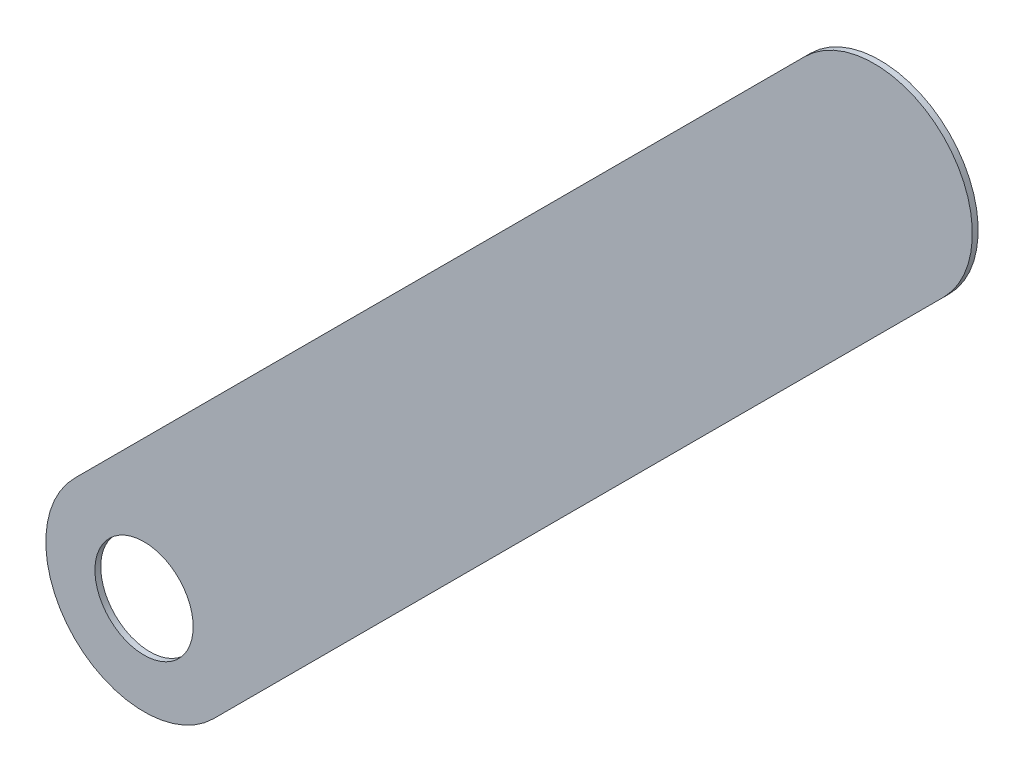
ISO-10303-21;
HEADER;
FILE_DESCRIPTION(('STEP AP214'),'2;1');
FILE_NAME('part.step','',(''),(''),'','','');
FILE_SCHEMA(('AUTOMOTIVE_DESIGN { 1 0 10303 214 1 1 1 1 }'));
ENDSEC;
DATA;
#1=APPLICATION_CONTEXT('core data for automotive mechanical design processes');
#2=APPLICATION_PROTOCOL_DEFINITION('international standard','automotive_design',2000,#1);
#3=PRODUCT_CONTEXT('',#1,'mechanical');
#4=PRODUCT('Part','Part','',(#3));
#5=PRODUCT_RELATED_PRODUCT_CATEGORY('part','',(#4));
#6=PRODUCT_DEFINITION_FORMATION('','',#4);
#7=PRODUCT_DEFINITION_CONTEXT('part definition',#1,'design');
#8=PRODUCT_DEFINITION('design','',#6,#7);
#9=PRODUCT_DEFINITION_SHAPE('','',#8);
#10=(LENGTH_UNIT() NAMED_UNIT(*) SI_UNIT(.MILLI.,.METRE.));
#11=(NAMED_UNIT(*) PLANE_ANGLE_UNIT() SI_UNIT($,.RADIAN.));
#12=(NAMED_UNIT(*) SI_UNIT($,.STERADIAN.) SOLID_ANGLE_UNIT());
#13=UNCERTAINTY_MEASURE_WITH_UNIT(LENGTH_MEASURE(1.E-05),#10,'distance_accuracy_value','');
#14=(GEOMETRIC_REPRESENTATION_CONTEXT(3) GLOBAL_UNCERTAINTY_ASSIGNED_CONTEXT((#13)) GLOBAL_UNIT_ASSIGNED_CONTEXT((#10,
#11,#12)) REPRESENTATION_CONTEXT('',''));
#15=CARTESIAN_POINT('',(0.,0.,0.));
#16=DIRECTION('',(0.,0.,1.));
#17=DIRECTION('',(1.,0.,0.));
#18=AXIS2_PLACEMENT_3D('',#15,#16,#17);
#19=CARTESIAN_POINT('',(55.32428102,78.07575698,0.));
#20=DIRECTION('',(-0.707106781186548,0.707106781186548,0.));
#21=DIRECTION('',(0.707106781186548,0.707106781186548,0.));
#22=AXIS2_PLACEMENT_3D('',#19,#20,#21);
#23=PLANE('',#22);
#24=DIRECTION('',(0.707106781186548,0.707106781186548,0.));
#25=VECTOR('',#24,1.);
#26=CARTESIAN_POINT('',(55.32428102,78.07575698,0.03556));
#27=LINE('',#26,#25);
#28=CARTESIAN_POINT('',(55.32428102,78.07575698,0.03556));
#29=VERTEX_POINT('',#28);
#30=CARTESIAN_POINT('',(59.78426702,82.53574298,0.03556));
#31=VERTEX_POINT('',#30);
#32=EDGE_CURVE('E11',#29,#31,#27,.T.);
#33=ORIENTED_EDGE('',*,*,#32,.F.);
#34=DIRECTION('',(0.,0.,1.));
#35=VECTOR('',#34,1.);
#36=CARTESIAN_POINT('',(55.32428102,78.07575698,0.));
#37=LINE('',#36,#35);
#38=CARTESIAN_POINT('',(55.32428102,78.07575698,0.));
#39=VERTEX_POINT('',#38);
#40=EDGE_CURVE('E24',#39,#29,#37,.T.);
#41=ORIENTED_EDGE('',*,*,#40,.F.);
#42=DIRECTION('',(0.707106781186548,0.707106781186548,0.));
#43=VECTOR('',#42,1.);
#44=CARTESIAN_POINT('',(55.32428102,78.07575698,0.));
#45=LINE('',#44,#43);
#46=CARTESIAN_POINT('',(59.78426702,82.53574298,0.));
#47=VERTEX_POINT('',#46);
#48=EDGE_CURVE('E96',#39,#47,#45,.T.);
#49=ORIENTED_EDGE('',*,*,#48,.T.);
#50=DIRECTION('',(0.,0.,1.));
#51=VECTOR('',#50,1.);
#52=CARTESIAN_POINT('',(59.78426702,82.53574298,0.));
#53=LINE('',#52,#51);
#54=EDGE_CURVE('E37',#47,#31,#53,.T.);
#55=ORIENTED_EDGE('',*,*,#54,.T.);
#56=EDGE_LOOP('',(#33,#41,#49,#55));
#57=FACE_BOUND('',#56,.T.);
#58=ADVANCED_FACE('F17',(#57),#23,.F.);
#59=CARTESIAN_POINT('',(54.9000172,78.5000208,0.));
#60=DIRECTION('',(0.,0.,-1.));
#61=DIRECTION('',(-0.707106781186536,0.707106781186559,0.));
#62=AXIS2_PLACEMENT_3D('',#59,#60,#61);
#63=CYLINDRICAL_SURFACE('',#62,0.599999648268213);
#64=CARTESIAN_POINT('',(54.9000172,78.5000208,0.03556));
#65=DIRECTION('',(0.,0.,1.));
#66=DIRECTION('',(-0.707106781186536,0.707106781186559,0.));
#67=AXIS2_PLACEMENT_3D('',#64,#65,#66);
#68=CIRCLE('',#67,0.599999648268213);
#69=CARTESIAN_POINT('',(54.47575338,78.92428462,0.03556));
#70=VERTEX_POINT('',#69);
#71=EDGE_CURVE('E92',#70,#29,#68,.T.);
#72=ORIENTED_EDGE('',*,*,#71,.F.);
#73=DIRECTION('',(0.,0.,1.));
#74=VECTOR('',#73,1.);
#75=CARTESIAN_POINT('',(54.47575338,78.92428462,0.));
#76=LINE('',#75,#74);
#77=CARTESIAN_POINT('',(54.47575338,78.92428462,0.));
#78=VERTEX_POINT('',#77);
#79=EDGE_CURVE('E90',#78,#70,#76,.T.);
#80=ORIENTED_EDGE('',*,*,#79,.F.);
#81=CARTESIAN_POINT('',(54.9000172,78.5000208,0.));
#82=DIRECTION('',(0.,0.,1.));
#83=DIRECTION('',(-0.707106781186536,0.707106781186559,0.));
#84=AXIS2_PLACEMENT_3D('',#81,#82,#83);
#85=CIRCLE('',#84,0.599999648268213);
#86=EDGE_CURVE('E88',#78,#39,#85,.T.);
#87=ORIENTED_EDGE('',*,*,#86,.T.);
#88=ORIENTED_EDGE('',*,*,#40,.T.);
#89=EDGE_LOOP('',(#72,#80,#87,#88));
#90=FACE_BOUND('',#89,.T.);
#91=ADVANCED_FACE('F111',(#90),#63,.T.);
#92=CARTESIAN_POINT('',(59.3600032,82.9600068,0.));
#93=DIRECTION('',(0.,0.,-1.));
#94=DIRECTION('',(0.707106781186542,-0.707106781186554,0.));
#95=AXIS2_PLACEMENT_3D('',#92,#93,#94);
#96=CYLINDRICAL_SURFACE('',#95,0.599999648268216);
#97=CARTESIAN_POINT('',(59.3600032,82.9600068,0.03556));
#98=DIRECTION('',(0.,0.,1.));
#99=DIRECTION('',(0.707106781186542,-0.707106781186554,0.));
#100=AXIS2_PLACEMENT_3D('',#97,#98,#99);
#101=CIRCLE('',#100,0.599999648268216);
#102=CARTESIAN_POINT('',(58.93573938,83.38427062,0.03556));
#103=VERTEX_POINT('',#102);
#104=EDGE_CURVE('E85',#31,#103,#101,.T.);
#105=ORIENTED_EDGE('',*,*,#104,.F.);
#106=ORIENTED_EDGE('',*,*,#54,.F.);
#107=CARTESIAN_POINT('',(59.3600032,82.9600068,0.));
#108=DIRECTION('',(0.,0.,1.));
#109=DIRECTION('',(0.707106781186542,-0.707106781186554,0.));
#110=AXIS2_PLACEMENT_3D('',#107,#108,#109);
#111=CIRCLE('',#110,0.599999648268216);
#112=CARTESIAN_POINT('',(58.93573938,83.38427062,0.));
#113=VERTEX_POINT('',#112);
#114=EDGE_CURVE('E82',#47,#113,#111,.T.);
#115=ORIENTED_EDGE('',*,*,#114,.T.);
#116=DIRECTION('',(0.,0.,1.));
#117=VECTOR('',#116,1.);
#118=CARTESIAN_POINT('',(58.93573938,83.38427062,0.));
#119=LINE('',#118,#117);
#120=EDGE_CURVE('E80',#113,#103,#119,.T.);
#121=ORIENTED_EDGE('',*,*,#120,.T.);
#122=EDGE_LOOP('',(#105,#106,#115,#121));
#123=FACE_BOUND('',#122,.T.);
#124=ADVANCED_FACE('F104',(#123),#96,.T.);
#125=CARTESIAN_POINT('',(58.93573938,83.38427062,0.));
#126=DIRECTION('',(0.707106781186548,-0.707106781186547,0.));
#127=DIRECTION('',(-0.707106781186547,-0.707106781186548,0.));
#128=AXIS2_PLACEMENT_3D('',#125,#126,#127);
#129=PLANE('',#128);
#130=DIRECTION('',(-0.707106781186547,-0.707106781186548,0.));
#131=VECTOR('',#130,1.);
#132=CARTESIAN_POINT('',(58.93573938,83.38427062,0.03556));
#133=LINE('',#132,#131);
#134=EDGE_CURVE('E77',#103,#70,#133,.T.);
#135=ORIENTED_EDGE('',*,*,#134,.F.);
#136=ORIENTED_EDGE('',*,*,#120,.F.);
#137=DIRECTION('',(-0.707106781186547,-0.707106781186548,0.));
#138=VECTOR('',#137,1.);
#139=CARTESIAN_POINT('',(58.93573938,83.38427062,0.));
#140=LINE('',#139,#138);
#141=EDGE_CURVE('E68',#113,#78,#140,.T.);
#142=ORIENTED_EDGE('',*,*,#141,.T.);
#143=ORIENTED_EDGE('',*,*,#79,.T.);
#144=EDGE_LOOP('',(#135,#136,#142,#143));
#145=FACE_BOUND('',#144,.T.);
#146=ADVANCED_FACE('F110',(#145),#129,.F.);
#147=CARTESIAN_POINT('',(54.9000172,78.5000208,0.));
#148=DIRECTION('',(0.,0.,-1.));
#149=DIRECTION('',(1.,0.,0.));
#150=AXIS2_PLACEMENT_3D('',#147,#148,#149);
#151=CYLINDRICAL_SURFACE('',#150,0.2999994);
#152=DIRECTION('',(0.,0.,1.));
#153=VECTOR('',#152,1.);
#154=CARTESIAN_POINT('',(55.2000166,78.5000208,0.));
#155=LINE('',#154,#153);
#156=CARTESIAN_POINT('',(55.2000166,78.5000208,0.));
#157=VERTEX_POINT('',#156);
#158=CARTESIAN_POINT('',(55.2000166,78.5000208,0.03556));
#159=VERTEX_POINT('',#158);
#160=EDGE_CURVE('E62',#157,#159,#155,.T.);
#161=ORIENTED_EDGE('',*,*,#160,.T.);
#162=CARTESIAN_POINT('',(54.9000172,78.5000208,0.03556));
#163=DIRECTION('',(0.,0.,1.));
#164=DIRECTION('',(1.,0.,0.));
#165=AXIS2_PLACEMENT_3D('',#162,#163,#164);
#166=CIRCLE('',#165,0.2999994);
#167=EDGE_CURVE('E67',#159,#159,#166,.T.);
#168=ORIENTED_EDGE('',*,*,#167,.T.);
#169=ORIENTED_EDGE('',*,*,#160,.F.);
#170=CARTESIAN_POINT('',(54.9000172,78.5000208,0.));
#171=DIRECTION('',(0.,0.,1.));
#172=DIRECTION('',(1.,0.,0.));
#173=AXIS2_PLACEMENT_3D('',#170,#171,#172);
#174=CIRCLE('',#173,0.2999994);
#175=EDGE_CURVE('E65',#157,#157,#174,.T.);
#176=ORIENTED_EDGE('',*,*,#175,.F.);
#177=EDGE_LOOP('',(#161,#168,#169,#176));
#178=FACE_BOUND('',#177,.T.);
#179=ADVANCED_FACE('F64',(#178),#151,.F.);
#180=CARTESIAN_POINT('',(55.32428102,78.07575698,0.));
#181=DIRECTION('',(0.,0.,-1.));
#182=DIRECTION('',(-1.,0.,0.));
#183=AXIS2_PLACEMENT_3D('',#180,#181,#182);
#184=PLANE('',#183);
#185=ORIENTED_EDGE('',*,*,#48,.F.);
#186=ORIENTED_EDGE('',*,*,#86,.F.);
#187=ORIENTED_EDGE('',*,*,#141,.F.);
#188=ORIENTED_EDGE('',*,*,#114,.F.);
#189=EDGE_LOOP('',(#185,#186,#187,#188));
#190=FACE_BOUND('',#189,.T.);
#191=ORIENTED_EDGE('',*,*,#175,.T.);
#192=EDGE_LOOP('',(#191));
#193=FACE_BOUND('',#192,.T.);
#194=ADVANCED_FACE('F71',(#190,#193),#184,.T.);
#195=CARTESIAN_POINT('',(55.32428102,78.07575698,0.03556));
#196=DIRECTION('',(0.,0.,-1.));
#197=DIRECTION('',(-1.,0.,0.));
#198=AXIS2_PLACEMENT_3D('',#195,#196,#197);
#199=PLANE('',#198);
#200=ORIENTED_EDGE('',*,*,#134,.T.);
#201=ORIENTED_EDGE('',*,*,#71,.T.);
#202=ORIENTED_EDGE('',*,*,#32,.T.);
#203=ORIENTED_EDGE('',*,*,#104,.T.);
#204=EDGE_LOOP('',(#200,#201,#202,#203));
#205=FACE_BOUND('',#204,.T.);
#206=ORIENTED_EDGE('',*,*,#167,.F.);
#207=EDGE_LOOP('',(#206));
#208=FACE_BOUND('',#207,.T.);
#209=ADVANCED_FACE('F107',(#205,#208),#199,.F.);
#210=CLOSED_SHELL('',(#58,#91,#124,#146,#179,#194,#209));
#211=MANIFOLD_SOLID_BREP('B1',#210);
#212=ADVANCED_BREP_SHAPE_REPRESENTATION('',(#18,#211),#14);
#213=SHAPE_DEFINITION_REPRESENTATION(#9,#212);
ENDSEC;
END-ISO-10303-21;
